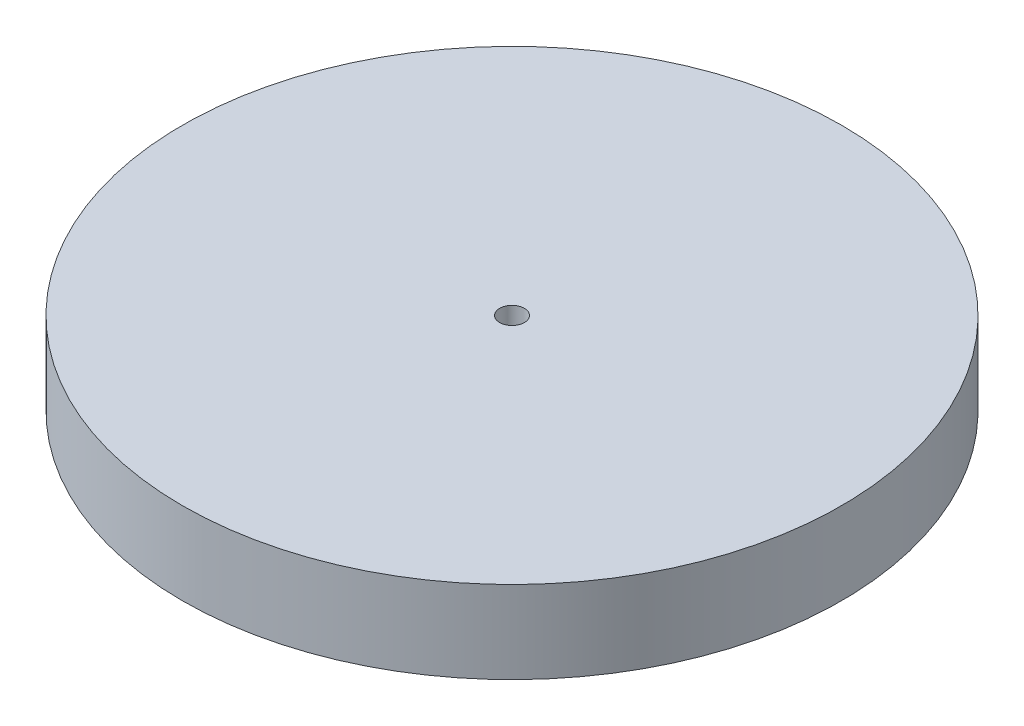
ISO-10303-21;
HEADER;
FILE_DESCRIPTION(('STEP AP214'),'2;1');
FILE_NAME('part.step','',(''),(''),'','','');
FILE_SCHEMA(('AUTOMOTIVE_DESIGN { 1 0 10303 214 1 1 1 1 }'));
ENDSEC;
DATA;
#1=APPLICATION_CONTEXT('core data for automotive mechanical design processes');
#2=APPLICATION_PROTOCOL_DEFINITION('international standard','automotive_design',2000,#1);
#3=PRODUCT_CONTEXT('',#1,'mechanical');
#4=PRODUCT('Part','Part','',(#3));
#5=PRODUCT_RELATED_PRODUCT_CATEGORY('part','',(#4));
#6=PRODUCT_DEFINITION_FORMATION('','',#4);
#7=PRODUCT_DEFINITION_CONTEXT('part definition',#1,'design');
#8=PRODUCT_DEFINITION('design','',#6,#7);
#9=PRODUCT_DEFINITION_SHAPE('','',#8);
#10=(LENGTH_UNIT() NAMED_UNIT(*) SI_UNIT(.MILLI.,.METRE.));
#11=(NAMED_UNIT(*) PLANE_ANGLE_UNIT() SI_UNIT($,.RADIAN.));
#12=(NAMED_UNIT(*) SI_UNIT($,.STERADIAN.) SOLID_ANGLE_UNIT());
#13=UNCERTAINTY_MEASURE_WITH_UNIT(LENGTH_MEASURE(1.E-05),#10,'distance_accuracy_value','');
#14=(GEOMETRIC_REPRESENTATION_CONTEXT(3) GLOBAL_UNCERTAINTY_ASSIGNED_CONTEXT((#13)) GLOBAL_UNIT_ASSIGNED_CONTEXT((#10,
#11,#12)) REPRESENTATION_CONTEXT('',''));
#15=CARTESIAN_POINT('',(0.,0.,0.));
#16=DIRECTION('',(0.,0.,1.));
#17=DIRECTION('',(1.,0.,0.));
#18=AXIS2_PLACEMENT_3D('',#15,#16,#17);
#19=CARTESIAN_POINT('',(0.,10.,0.));
#20=DIRECTION('',(0.,1.,0.));
#21=DIRECTION('',(0.,0.,1.));
#22=AXIS2_PLACEMENT_3D('',#19,#20,#21);
#23=PLANE('',#22);
#24=CARTESIAN_POINT('',(0.,10.,0.));
#25=DIRECTION('',(0.,1.,0.));
#26=DIRECTION('',(0.,0.,1.));
#27=AXIS2_PLACEMENT_3D('',#24,#25,#26);
#28=CIRCLE('',#27,40.);
#29=CARTESIAN_POINT('',(0.,10.,40.));
#30=VERTEX_POINT('',#29);
#31=EDGE_CURVE('E10',#30,#30,#28,.T.);
#32=ORIENTED_EDGE('',*,*,#31,.T.);
#33=EDGE_LOOP('',(#32));
#34=FACE_BOUND('',#33,.T.);
#35=CARTESIAN_POINT('',(0.,10.,0.));
#36=DIRECTION('',(0.,1.,0.));
#37=DIRECTION('',(0.,0.,1.));
#38=AXIS2_PLACEMENT_3D('',#35,#36,#37);
#39=CIRCLE('',#38,1.5);
#40=CARTESIAN_POINT('',(0.,10.,1.5));
#41=VERTEX_POINT('',#40);
#42=EDGE_CURVE('E42',#41,#41,#39,.T.);
#43=ORIENTED_EDGE('',*,*,#42,.F.);
#44=EDGE_LOOP('',(#43));
#45=FACE_BOUND('',#44,.T.);
#46=ADVANCED_FACE('F31',(#34,#45),#23,.T.);
#47=CARTESIAN_POINT('',(0.,0.,0.));
#48=DIRECTION('',(0.,1.,0.));
#49=DIRECTION('',(0.,0.,1.));
#50=AXIS2_PLACEMENT_3D('',#47,#48,#49);
#51=PLANE('',#50);
#52=CARTESIAN_POINT('',(0.,0.,0.));
#53=DIRECTION('',(0.,1.,0.));
#54=DIRECTION('',(0.,0.,1.));
#55=AXIS2_PLACEMENT_3D('',#52,#53,#54);
#56=CIRCLE('',#55,40.);
#57=CARTESIAN_POINT('',(0.,0.,40.));
#58=VERTEX_POINT('',#57);
#59=EDGE_CURVE('E35',#58,#58,#56,.T.);
#60=ORIENTED_EDGE('',*,*,#59,.F.);
#61=EDGE_LOOP('',(#60));
#62=FACE_BOUND('',#61,.T.);
#63=CARTESIAN_POINT('',(0.,0.,0.));
#64=DIRECTION('',(0.,1.,0.));
#65=DIRECTION('',(0.,0.,1.));
#66=AXIS2_PLACEMENT_3D('',#63,#64,#65);
#67=CIRCLE('',#66,1.5);
#68=CARTESIAN_POINT('',(0.,0.,1.5));
#69=VERTEX_POINT('',#68);
#70=EDGE_CURVE('E44',#69,#69,#67,.T.);
#71=ORIENTED_EDGE('',*,*,#70,.T.);
#72=EDGE_LOOP('',(#71));
#73=FACE_BOUND('',#72,.T.);
#74=ADVANCED_FACE('F54',(#62,#73),#51,.F.);
#75=CARTESIAN_POINT('',(0.,10.,0.));
#76=DIRECTION('',(0.,-1.,0.));
#77=DIRECTION('',(0.,0.,-1.));
#78=AXIS2_PLACEMENT_3D('',#75,#76,#77);
#79=CYLINDRICAL_SURFACE('',#78,40.);
#80=ORIENTED_EDGE('',*,*,#31,.F.);
#81=EDGE_LOOP('',(#80));
#82=FACE_BOUND('',#81,.T.);
#83=ORIENTED_EDGE('',*,*,#59,.T.);
#84=EDGE_LOOP('',(#83));
#85=FACE_BOUND('',#84,.T.);
#86=ADVANCED_FACE('F33',(#82,#85),#79,.T.);
#87=CARTESIAN_POINT('',(0.,10.,0.));
#88=DIRECTION('',(0.,-1.,0.));
#89=DIRECTION('',(0.,0.,-1.));
#90=AXIS2_PLACEMENT_3D('',#87,#88,#89);
#91=CYLINDRICAL_SURFACE('',#90,1.5);
#92=ORIENTED_EDGE('',*,*,#42,.T.);
#93=EDGE_LOOP('',(#92));
#94=FACE_BOUND('',#93,.T.);
#95=ORIENTED_EDGE('',*,*,#70,.F.);
#96=EDGE_LOOP('',(#95));
#97=FACE_BOUND('',#96,.T.);
#98=ADVANCED_FACE('F50',(#94,#97),#91,.F.);
#99=CLOSED_SHELL('',(#46,#74,#86,#98));
#100=MANIFOLD_SOLID_BREP('B2',#99);
#101=ADVANCED_BREP_SHAPE_REPRESENTATION('',(#18,#100),#14);
#102=SHAPE_DEFINITION_REPRESENTATION(#9,#101);
ENDSEC;
END-ISO-10303-21;
